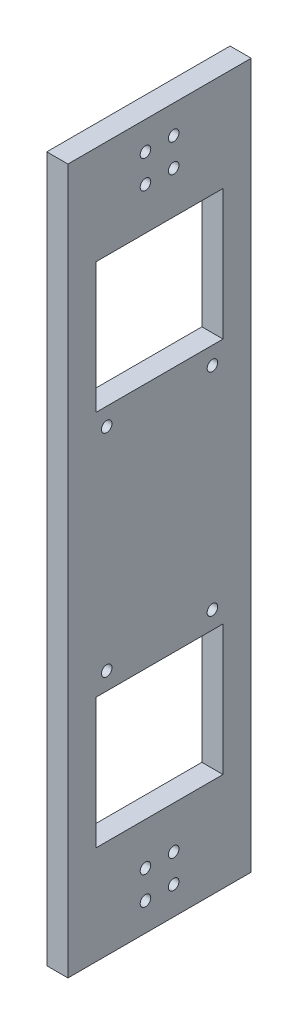
ISO-10303-21;
HEADER;
FILE_DESCRIPTION(('STEP AP214'),'2;1');
FILE_NAME('part.step','',(''),(''),'','','');
FILE_SCHEMA(('AUTOMOTIVE_DESIGN { 1 0 10303 214 1 1 1 1 }'));
ENDSEC;
DATA;
#1=APPLICATION_CONTEXT('core data for automotive mechanical design processes');
#2=APPLICATION_PROTOCOL_DEFINITION('international standard','automotive_design',2000,#1);
#3=PRODUCT_CONTEXT('',#1,'mechanical');
#4=PRODUCT('Part','Part','',(#3));
#5=PRODUCT_RELATED_PRODUCT_CATEGORY('part','',(#4));
#6=PRODUCT_DEFINITION_FORMATION('','',#4);
#7=PRODUCT_DEFINITION_CONTEXT('part definition',#1,'design');
#8=PRODUCT_DEFINITION('design','',#6,#7);
#9=PRODUCT_DEFINITION_SHAPE('','',#8);
#10=(LENGTH_UNIT() NAMED_UNIT(*) SI_UNIT(.MILLI.,.METRE.));
#11=(NAMED_UNIT(*) PLANE_ANGLE_UNIT() SI_UNIT($,.RADIAN.));
#12=(NAMED_UNIT(*) SI_UNIT($,.STERADIAN.) SOLID_ANGLE_UNIT());
#13=UNCERTAINTY_MEASURE_WITH_UNIT(LENGTH_MEASURE(1.E-05),#10,'distance_accuracy_value','');
#14=(GEOMETRIC_REPRESENTATION_CONTEXT(3) GLOBAL_UNCERTAINTY_ASSIGNED_CONTEXT((#13)) GLOBAL_UNIT_ASSIGNED_CONTEXT((#10,
#11,#12)) REPRESENTATION_CONTEXT('',''));
#15=CARTESIAN_POINT('',(0.,0.,0.));
#16=DIRECTION('',(0.,0.,1.));
#17=DIRECTION('',(1.,0.,0.));
#18=AXIS2_PLACEMENT_3D('',#15,#16,#17);
#19=CARTESIAN_POINT('',(-126.7,0.,0.));
#20=DIRECTION('',(-1.,0.,0.));
#21=DIRECTION('',(0.,0.,1.));
#22=AXIS2_PLACEMENT_3D('',#19,#20,#21);
#23=PLANE('',#22);
#24=DIRECTION('',(0.,-1.,0.));
#25=VECTOR('',#24,1.);
#26=CARTESIAN_POINT('',(-126.7,35.,18.));
#27=LINE('',#26,#25);
#28=CARTESIAN_POINT('',(-126.7,72.,18.));
#29=VERTEX_POINT('',#28);
#30=CARTESIAN_POINT('',(-126.7,35.,18.));
#31=VERTEX_POINT('',#30);
#32=EDGE_CURVE('E162',#29,#31,#27,.T.);
#33=ORIENTED_EDGE('',*,*,#32,.F.);
#34=DIRECTION('',(0.,0.,1.));
#35=VECTOR('',#34,1.);
#36=CARTESIAN_POINT('',(-126.7,72.,18.));
#37=LINE('',#36,#35);
#38=CARTESIAN_POINT('',(-126.7,72.,-18.));
#39=VERTEX_POINT('',#38);
#40=EDGE_CURVE('E170',#39,#29,#37,.T.);
#41=ORIENTED_EDGE('',*,*,#40,.F.);
#42=DIRECTION('',(0.,1.,0.));
#43=VECTOR('',#42,1.);
#44=CARTESIAN_POINT('',(-126.7,35.,-18.));
#45=LINE('',#44,#43);
#46=CARTESIAN_POINT('',(-126.7,35.,-18.));
#47=VERTEX_POINT('',#46);
#48=EDGE_CURVE('E167',#47,#39,#45,.T.);
#49=ORIENTED_EDGE('',*,*,#48,.F.);
#50=DIRECTION('',(0.,0.,-1.));
#51=VECTOR('',#50,1.);
#52=CARTESIAN_POINT('',(-126.7,35.,18.));
#53=LINE('',#52,#51);
#54=EDGE_CURVE('E164',#31,#47,#53,.T.);
#55=ORIENTED_EDGE('',*,*,#54,.F.);
#56=EDGE_LOOP('',(#33,#41,#49,#55));
#57=FACE_BOUND('',#56,.T.);
#58=CARTESIAN_POINT('',(-126.7,30.,-15.));
#59=DIRECTION('',(1.,0.,0.));
#60=DIRECTION('',(0.,0.,-1.));
#61=AXIS2_PLACEMENT_3D('',#58,#59,#60);
#62=CIRCLE('',#61,1.5);
#63=CARTESIAN_POINT('',(-126.7,30.,-16.5));
#64=VERTEX_POINT('',#63);
#65=EDGE_CURVE('E193',#64,#64,#62,.T.);
#66=ORIENTED_EDGE('',*,*,#65,.F.);
#67=EDGE_LOOP('',(#66));
#68=FACE_BOUND('',#67,.T.);
#69=CARTESIAN_POINT('',(-126.7,30.,15.));
#70=DIRECTION('',(1.,0.,0.));
#71=DIRECTION('',(0.,0.,-1.));
#72=AXIS2_PLACEMENT_3D('',#69,#70,#71);
#73=CIRCLE('',#72,1.5);
#74=CARTESIAN_POINT('',(-126.7,30.,13.5));
#75=VERTEX_POINT('',#74);
#76=EDGE_CURVE('E199',#75,#75,#73,.T.);
#77=ORIENTED_EDGE('',*,*,#76,.F.);
#78=EDGE_LOOP('',(#77));
#79=FACE_BOUND('',#78,.T.);
#80=CARTESIAN_POINT('',(-126.7,-30.,-15.));
#81=DIRECTION('',(1.,0.,0.));
#82=DIRECTION('',(0.,0.,-1.));
#83=AXIS2_PLACEMENT_3D('',#80,#81,#82);
#84=CIRCLE('',#83,1.5);
#85=CARTESIAN_POINT('',(-126.7,-30.,-16.5));
#86=VERTEX_POINT('',#85);
#87=EDGE_CURVE('E205',#86,#86,#84,.T.);
#88=ORIENTED_EDGE('',*,*,#87,.F.);
#89=EDGE_LOOP('',(#88));
#90=FACE_BOUND('',#89,.T.);
#91=CARTESIAN_POINT('',(-126.7,-30.,15.));
#92=DIRECTION('',(1.,0.,0.));
#93=DIRECTION('',(0.,0.,-1.));
#94=AXIS2_PLACEMENT_3D('',#91,#92,#93);
#95=CIRCLE('',#94,1.5);
#96=CARTESIAN_POINT('',(-126.7,-30.,13.5));
#97=VERTEX_POINT('',#96);
#98=EDGE_CURVE('E211',#97,#97,#95,.T.);
#99=ORIENTED_EDGE('',*,*,#98,.F.);
#100=EDGE_LOOP('',(#99));
#101=FACE_BOUND('',#100,.T.);
#102=CARTESIAN_POINT('',(-126.7,-84.,-4.));
#103=DIRECTION('',(1.,0.,0.));
#104=DIRECTION('',(0.,0.,-1.));
#105=AXIS2_PLACEMENT_3D('',#102,#103,#104);
#106=CIRCLE('',#105,1.5);
#107=CARTESIAN_POINT('',(-126.7,-84.,-5.5));
#108=VERTEX_POINT('',#107);
#109=EDGE_CURVE('E217',#108,#108,#106,.T.);
#110=ORIENTED_EDGE('',*,*,#109,.F.);
#111=EDGE_LOOP('',(#110));
#112=FACE_BOUND('',#111,.T.);
#113=CARTESIAN_POINT('',(-126.7,-84.,4.));
#114=DIRECTION('',(1.,0.,0.));
#115=DIRECTION('',(0.,0.,-1.));
#116=AXIS2_PLACEMENT_3D('',#113,#114,#115);
#117=CIRCLE('',#116,1.5);
#118=CARTESIAN_POINT('',(-126.7,-84.,2.5));
#119=VERTEX_POINT('',#118);
#120=EDGE_CURVE('E223',#119,#119,#117,.T.);
#121=ORIENTED_EDGE('',*,*,#120,.F.);
#122=EDGE_LOOP('',(#121));
#123=FACE_BOUND('',#122,.T.);
#124=CARTESIAN_POINT('',(-126.7,-92.,-4.));
#125=DIRECTION('',(1.,0.,0.));
#126=DIRECTION('',(0.,0.,-1.));
#127=AXIS2_PLACEMENT_3D('',#124,#125,#126);
#128=CIRCLE('',#127,1.5);
#129=CARTESIAN_POINT('',(-126.7,-92.,-5.5));
#130=VERTEX_POINT('',#129);
#131=EDGE_CURVE('E229',#130,#130,#128,.T.);
#132=ORIENTED_EDGE('',*,*,#131,.F.);
#133=EDGE_LOOP('',(#132));
#134=FACE_BOUND('',#133,.T.);
#135=CARTESIAN_POINT('',(-126.7,-92.,4.));
#136=DIRECTION('',(1.,0.,0.));
#137=DIRECTION('',(0.,0.,-1.));
#138=AXIS2_PLACEMENT_3D('',#135,#136,#137);
#139=CIRCLE('',#138,1.5);
#140=CARTESIAN_POINT('',(-126.7,-92.,2.5));
#141=VERTEX_POINT('',#140);
#142=EDGE_CURVE('E235',#141,#141,#139,.T.);
#143=ORIENTED_EDGE('',*,*,#142,.F.);
#144=EDGE_LOOP('',(#143));
#145=FACE_BOUND('',#144,.T.);
#146=CARTESIAN_POINT('',(-126.7,92.,-4.));
#147=DIRECTION('',(1.,0.,0.));
#148=DIRECTION('',(0.,0.,-1.));
#149=AXIS2_PLACEMENT_3D('',#146,#147,#148);
#150=CIRCLE('',#149,1.5);
#151=CARTESIAN_POINT('',(-126.7,92.,-5.5));
#152=VERTEX_POINT('',#151);
#153=EDGE_CURVE('E241',#152,#152,#150,.T.);
#154=ORIENTED_EDGE('',*,*,#153,.F.);
#155=EDGE_LOOP('',(#154));
#156=FACE_BOUND('',#155,.T.);
#157=CARTESIAN_POINT('',(-126.7,92.,4.));
#158=DIRECTION('',(1.,0.,0.));
#159=DIRECTION('',(0.,0.,-1.));
#160=AXIS2_PLACEMENT_3D('',#157,#158,#159);
#161=CIRCLE('',#160,1.5);
#162=CARTESIAN_POINT('',(-126.7,92.,2.5));
#163=VERTEX_POINT('',#162);
#164=EDGE_CURVE('E247',#163,#163,#161,.T.);
#165=ORIENTED_EDGE('',*,*,#164,.F.);
#166=EDGE_LOOP('',(#165));
#167=FACE_BOUND('',#166,.T.);
#168=CARTESIAN_POINT('',(-126.7,84.,-4.));
#169=DIRECTION('',(1.,0.,0.));
#170=DIRECTION('',(0.,0.,-1.));
#171=AXIS2_PLACEMENT_3D('',#168,#169,#170);
#172=CIRCLE('',#171,1.5);
#173=CARTESIAN_POINT('',(-126.7,84.,-5.5));
#174=VERTEX_POINT('',#173);
#175=EDGE_CURVE('E253',#174,#174,#172,.T.);
#176=ORIENTED_EDGE('',*,*,#175,.F.);
#177=EDGE_LOOP('',(#176));
#178=FACE_BOUND('',#177,.T.);
#179=CARTESIAN_POINT('',(-126.7,84.,4.));
#180=DIRECTION('',(1.,0.,0.));
#181=DIRECTION('',(0.,0.,-1.));
#182=AXIS2_PLACEMENT_3D('',#179,#180,#181);
#183=CIRCLE('',#182,1.5);
#184=CARTESIAN_POINT('',(-126.7,84.,2.5));
#185=VERTEX_POINT('',#184);
#186=EDGE_CURVE('E259',#185,#185,#183,.T.);
#187=ORIENTED_EDGE('',*,*,#186,.F.);
#188=EDGE_LOOP('',(#187));
#189=FACE_BOUND('',#188,.T.);
#190=DIRECTION('',(0.,-1.,0.));
#191=VECTOR('',#190,1.);
#192=CARTESIAN_POINT('',(-126.7,-100.,26.));
#193=LINE('',#192,#191);
#194=CARTESIAN_POINT('',(-126.7,100.,26.));
#195=VERTEX_POINT('',#194);
#196=CARTESIAN_POINT('',(-126.7,-100.,26.));
#197=VERTEX_POINT('',#196);
#198=EDGE_CURVE('E265',#195,#197,#193,.T.);
#199=ORIENTED_EDGE('',*,*,#198,.T.);
#200=DIRECTION('',(0.,0.,-1.));
#201=VECTOR('',#200,1.);
#202=CARTESIAN_POINT('',(-126.7,-100.,26.));
#203=LINE('',#202,#201);
#204=CARTESIAN_POINT('',(-126.7,-100.,-26.));
#205=VERTEX_POINT('',#204);
#206=EDGE_CURVE('E268',#197,#205,#203,.T.);
#207=ORIENTED_EDGE('',*,*,#206,.T.);
#208=DIRECTION('',(0.,1.,0.));
#209=VECTOR('',#208,1.);
#210=CARTESIAN_POINT('',(-126.7,-100.,-26.));
#211=LINE('',#210,#209);
#212=CARTESIAN_POINT('',(-126.7,100.,-26.));
#213=VERTEX_POINT('',#212);
#214=EDGE_CURVE('E271',#205,#213,#211,.T.);
#215=ORIENTED_EDGE('',*,*,#214,.T.);
#216=DIRECTION('',(0.,0.,1.));
#217=VECTOR('',#216,1.);
#218=CARTESIAN_POINT('',(-126.7,100.,26.));
#219=LINE('',#218,#217);
#220=EDGE_CURVE('E273',#213,#195,#219,.T.);
#221=ORIENTED_EDGE('',*,*,#220,.T.);
#222=EDGE_LOOP('',(#199,#207,#215,#221));
#223=FACE_BOUND('',#222,.T.);
#224=DIRECTION('',(0.,-1.,0.));
#225=VECTOR('',#224,1.);
#226=CARTESIAN_POINT('',(-126.7,-72.,18.));
#227=LINE('',#226,#225);
#228=CARTESIAN_POINT('',(-126.7,-35.,18.));
#229=VERTEX_POINT('',#228);
#230=CARTESIAN_POINT('',(-126.7,-72.,18.));
#231=VERTEX_POINT('',#230);
#232=EDGE_CURVE('E126',#229,#231,#227,.T.);
#233=ORIENTED_EDGE('',*,*,#232,.F.);
#234=DIRECTION('',(0.,0.,1.));
#235=VECTOR('',#234,1.);
#236=CARTESIAN_POINT('',(-126.7,-35.,18.));
#237=LINE('',#236,#235);
#238=CARTESIAN_POINT('',(-126.7,-35.,-18.));
#239=VERTEX_POINT('',#238);
#240=EDGE_CURVE('E148',#239,#229,#237,.T.);
#241=ORIENTED_EDGE('',*,*,#240,.F.);
#242=DIRECTION('',(0.,1.,0.));
#243=VECTOR('',#242,1.);
#244=CARTESIAN_POINT('',(-126.7,-72.,-18.));
#245=LINE('',#244,#243);
#246=CARTESIAN_POINT('',(-126.7,-72.,-18.));
#247=VERTEX_POINT('',#246);
#248=EDGE_CURVE('E146',#247,#239,#245,.T.);
#249=ORIENTED_EDGE('',*,*,#248,.F.);
#250=DIRECTION('',(0.,0.,-1.));
#251=VECTOR('',#250,1.);
#252=CARTESIAN_POINT('',(-126.7,-72.,18.));
#253=LINE('',#252,#251);
#254=EDGE_CURVE('E134',#231,#247,#253,.T.);
#255=ORIENTED_EDGE('',*,*,#254,.F.);
#256=EDGE_LOOP('',(#233,#241,#249,#255));
#257=FACE_BOUND('',#256,.T.);
#258=ADVANCED_FACE('F37',(#57,#68,#79,#90,#101,#112,#123,#134,#145,#156,#167,#178,#189,#223,
#257),#23,.F.);
#259=CARTESIAN_POINT('',(-132.7,0.,0.));
#260=DIRECTION('',(-1.,0.,0.));
#261=DIRECTION('',(0.,0.,1.));
#262=AXIS2_PLACEMENT_3D('',#259,#260,#261);
#263=PLANE('',#262);
#264=CARTESIAN_POINT('',(-132.7,30.,-15.));
#265=DIRECTION('',(1.,0.,0.));
#266=DIRECTION('',(0.,0.,-1.));
#267=AXIS2_PLACEMENT_3D('',#264,#265,#266);
#268=CIRCLE('',#267,1.5);
#269=CARTESIAN_POINT('',(-132.7,30.,-16.5));
#270=VERTEX_POINT('',#269);
#271=EDGE_CURVE('E192',#270,#270,#268,.T.);
#272=ORIENTED_EDGE('',*,*,#271,.T.);
#273=EDGE_LOOP('',(#272));
#274=FACE_BOUND('',#273,.T.);
#275=CARTESIAN_POINT('',(-132.7,30.,15.));
#276=DIRECTION('',(1.,0.,0.));
#277=DIRECTION('',(0.,0.,-1.));
#278=AXIS2_PLACEMENT_3D('',#275,#276,#277);
#279=CIRCLE('',#278,1.5);
#280=CARTESIAN_POINT('',(-132.7,30.,13.5));
#281=VERTEX_POINT('',#280);
#282=EDGE_CURVE('E196',#281,#281,#279,.T.);
#283=ORIENTED_EDGE('',*,*,#282,.T.);
#284=EDGE_LOOP('',(#283));
#285=FACE_BOUND('',#284,.T.);
#286=CARTESIAN_POINT('',(-132.7,-30.,-15.));
#287=DIRECTION('',(1.,0.,0.));
#288=DIRECTION('',(0.,0.,-1.));
#289=AXIS2_PLACEMENT_3D('',#286,#287,#288);
#290=CIRCLE('',#289,1.5);
#291=CARTESIAN_POINT('',(-132.7,-30.,-16.5));
#292=VERTEX_POINT('',#291);
#293=EDGE_CURVE('E202',#292,#292,#290,.T.);
#294=ORIENTED_EDGE('',*,*,#293,.T.);
#295=EDGE_LOOP('',(#294));
#296=FACE_BOUND('',#295,.T.);
#297=CARTESIAN_POINT('',(-132.7,-30.,15.));
#298=DIRECTION('',(1.,0.,0.));
#299=DIRECTION('',(0.,0.,-1.));
#300=AXIS2_PLACEMENT_3D('',#297,#298,#299);
#301=CIRCLE('',#300,1.5);
#302=CARTESIAN_POINT('',(-132.7,-30.,13.5));
#303=VERTEX_POINT('',#302);
#304=EDGE_CURVE('E208',#303,#303,#301,.T.);
#305=ORIENTED_EDGE('',*,*,#304,.T.);
#306=EDGE_LOOP('',(#305));
#307=FACE_BOUND('',#306,.T.);
#308=CARTESIAN_POINT('',(-132.7,-84.,-4.));
#309=DIRECTION('',(1.,0.,0.));
#310=DIRECTION('',(0.,0.,-1.));
#311=AXIS2_PLACEMENT_3D('',#308,#309,#310);
#312=CIRCLE('',#311,1.5);
#313=CARTESIAN_POINT('',(-132.7,-84.,-5.5));
#314=VERTEX_POINT('',#313);
#315=EDGE_CURVE('E214',#314,#314,#312,.T.);
#316=ORIENTED_EDGE('',*,*,#315,.T.);
#317=EDGE_LOOP('',(#316));
#318=FACE_BOUND('',#317,.T.);
#319=CARTESIAN_POINT('',(-132.7,-84.,4.));
#320=DIRECTION('',(1.,0.,0.));
#321=DIRECTION('',(0.,0.,-1.));
#322=AXIS2_PLACEMENT_3D('',#319,#320,#321);
#323=CIRCLE('',#322,1.5);
#324=CARTESIAN_POINT('',(-132.7,-84.,2.5));
#325=VERTEX_POINT('',#324);
#326=EDGE_CURVE('E220',#325,#325,#323,.T.);
#327=ORIENTED_EDGE('',*,*,#326,.T.);
#328=EDGE_LOOP('',(#327));
#329=FACE_BOUND('',#328,.T.);
#330=CARTESIAN_POINT('',(-132.7,-92.,-4.));
#331=DIRECTION('',(1.,0.,0.));
#332=DIRECTION('',(0.,0.,-1.));
#333=AXIS2_PLACEMENT_3D('',#330,#331,#332);
#334=CIRCLE('',#333,1.5);
#335=CARTESIAN_POINT('',(-132.7,-92.,-5.5));
#336=VERTEX_POINT('',#335);
#337=EDGE_CURVE('E226',#336,#336,#334,.T.);
#338=ORIENTED_EDGE('',*,*,#337,.T.);
#339=EDGE_LOOP('',(#338));
#340=FACE_BOUND('',#339,.T.);
#341=CARTESIAN_POINT('',(-132.7,-92.,4.));
#342=DIRECTION('',(1.,0.,0.));
#343=DIRECTION('',(0.,0.,-1.));
#344=AXIS2_PLACEMENT_3D('',#341,#342,#343);
#345=CIRCLE('',#344,1.5);
#346=CARTESIAN_POINT('',(-132.7,-92.,2.5));
#347=VERTEX_POINT('',#346);
#348=EDGE_CURVE('E232',#347,#347,#345,.T.);
#349=ORIENTED_EDGE('',*,*,#348,.T.);
#350=EDGE_LOOP('',(#349));
#351=FACE_BOUND('',#350,.T.);
#352=CARTESIAN_POINT('',(-132.7,92.,-4.));
#353=DIRECTION('',(1.,0.,0.));
#354=DIRECTION('',(0.,0.,-1.));
#355=AXIS2_PLACEMENT_3D('',#352,#353,#354);
#356=CIRCLE('',#355,1.5);
#357=CARTESIAN_POINT('',(-132.7,92.,-5.5));
#358=VERTEX_POINT('',#357);
#359=EDGE_CURVE('E238',#358,#358,#356,.T.);
#360=ORIENTED_EDGE('',*,*,#359,.T.);
#361=EDGE_LOOP('',(#360));
#362=FACE_BOUND('',#361,.T.);
#363=CARTESIAN_POINT('',(-132.7,92.,4.));
#364=DIRECTION('',(1.,0.,0.));
#365=DIRECTION('',(0.,0.,-1.));
#366=AXIS2_PLACEMENT_3D('',#363,#364,#365);
#367=CIRCLE('',#366,1.5);
#368=CARTESIAN_POINT('',(-132.7,92.,2.5));
#369=VERTEX_POINT('',#368);
#370=EDGE_CURVE('E244',#369,#369,#367,.T.);
#371=ORIENTED_EDGE('',*,*,#370,.T.);
#372=EDGE_LOOP('',(#371));
#373=FACE_BOUND('',#372,.T.);
#374=CARTESIAN_POINT('',(-132.7,84.,-4.));
#375=DIRECTION('',(1.,0.,0.));
#376=DIRECTION('',(0.,0.,-1.));
#377=AXIS2_PLACEMENT_3D('',#374,#375,#376);
#378=CIRCLE('',#377,1.5);
#379=CARTESIAN_POINT('',(-132.7,84.,-5.5));
#380=VERTEX_POINT('',#379);
#381=EDGE_CURVE('E250',#380,#380,#378,.T.);
#382=ORIENTED_EDGE('',*,*,#381,.T.);
#383=EDGE_LOOP('',(#382));
#384=FACE_BOUND('',#383,.T.);
#385=CARTESIAN_POINT('',(-132.7,84.,4.));
#386=DIRECTION('',(1.,0.,0.));
#387=DIRECTION('',(0.,0.,-1.));
#388=AXIS2_PLACEMENT_3D('',#385,#386,#387);
#389=CIRCLE('',#388,1.5);
#390=CARTESIAN_POINT('',(-132.7,84.,2.5));
#391=VERTEX_POINT('',#390);
#392=EDGE_CURVE('E256',#391,#391,#389,.T.);
#393=ORIENTED_EDGE('',*,*,#392,.T.);
#394=EDGE_LOOP('',(#393));
#395=FACE_BOUND('',#394,.T.);
#396=DIRECTION('',(0.,-1.,0.));
#397=VECTOR('',#396,1.);
#398=CARTESIAN_POINT('',(-132.7,-100.,26.));
#399=LINE('',#398,#397);
#400=CARTESIAN_POINT('',(-132.7,100.,26.));
#401=VERTEX_POINT('',#400);
#402=CARTESIAN_POINT('',(-132.7,-100.,26.));
#403=VERTEX_POINT('',#402);
#404=EDGE_CURVE('E262',#401,#403,#399,.T.);
#405=ORIENTED_EDGE('',*,*,#404,.F.);
#406=DIRECTION('',(0.,0.,1.));
#407=VECTOR('',#406,1.);
#408=CARTESIAN_POINT('',(-132.7,100.,26.));
#409=LINE('',#408,#407);
#410=CARTESIAN_POINT('',(-132.7,100.,-26.));
#411=VERTEX_POINT('',#410);
#412=EDGE_CURVE('E269',#411,#401,#409,.T.);
#413=ORIENTED_EDGE('',*,*,#412,.F.);
#414=DIRECTION('',(0.,1.,0.));
#415=VECTOR('',#414,1.);
#416=CARTESIAN_POINT('',(-132.7,-100.,-26.));
#417=LINE('',#416,#415);
#418=CARTESIAN_POINT('',(-132.7,-100.,-26.));
#419=VERTEX_POINT('',#418);
#420=EDGE_CURVE('E280',#419,#411,#417,.T.);
#421=ORIENTED_EDGE('',*,*,#420,.F.);
#422=DIRECTION('',(0.,0.,-1.));
#423=VECTOR('',#422,1.);
#424=CARTESIAN_POINT('',(-132.7,-100.,26.));
#425=LINE('',#424,#423);
#426=EDGE_CURVE('E278',#403,#419,#425,.T.);
#427=ORIENTED_EDGE('',*,*,#426,.F.);
#428=EDGE_LOOP('',(#405,#413,#421,#427));
#429=FACE_BOUND('',#428,.T.);
#430=DIRECTION('',(0.,0.,1.));
#431=VECTOR('',#430,1.);
#432=CARTESIAN_POINT('',(-132.7,72.,18.));
#433=LINE('',#432,#431);
#434=CARTESIAN_POINT('',(-132.7,72.,-18.));
#435=VERTEX_POINT('',#434);
#436=CARTESIAN_POINT('',(-132.7,72.,18.));
#437=VERTEX_POINT('',#436);
#438=EDGE_CURVE('E165',#435,#437,#433,.T.);
#439=ORIENTED_EDGE('',*,*,#438,.T.);
#440=DIRECTION('',(0.,-1.,0.));
#441=VECTOR('',#440,1.);
#442=CARTESIAN_POINT('',(-132.7,35.,18.));
#443=LINE('',#442,#441);
#444=CARTESIAN_POINT('',(-132.7,35.,18.));
#445=VERTEX_POINT('',#444);
#446=EDGE_CURVE('E142',#437,#445,#443,.T.);
#447=ORIENTED_EDGE('',*,*,#446,.T.);
#448=DIRECTION('',(0.,0.,-1.));
#449=VECTOR('',#448,1.);
#450=CARTESIAN_POINT('',(-132.7,35.,18.));
#451=LINE('',#450,#449);
#452=CARTESIAN_POINT('',(-132.7,35.,-18.));
#453=VERTEX_POINT('',#452);
#454=EDGE_CURVE('E175',#445,#453,#451,.T.);
#455=ORIENTED_EDGE('',*,*,#454,.T.);
#456=DIRECTION('',(0.,1.,0.));
#457=VECTOR('',#456,1.);
#458=CARTESIAN_POINT('',(-132.7,35.,-18.));
#459=LINE('',#458,#457);
#460=EDGE_CURVE('E178',#453,#435,#459,.T.);
#461=ORIENTED_EDGE('',*,*,#460,.T.);
#462=EDGE_LOOP('',(#439,#447,#455,#461));
#463=FACE_BOUND('',#462,.T.);
#464=DIRECTION('',(0.,0.,1.));
#465=VECTOR('',#464,1.);
#466=CARTESIAN_POINT('',(-132.7,-35.,18.));
#467=LINE('',#466,#465);
#468=CARTESIAN_POINT('',(-132.7,-35.,-18.));
#469=VERTEX_POINT('',#468);
#470=CARTESIAN_POINT('',(-132.7,-35.,18.));
#471=VERTEX_POINT('',#470);
#472=EDGE_CURVE('E135',#469,#471,#467,.T.);
#473=ORIENTED_EDGE('',*,*,#472,.T.);
#474=DIRECTION('',(0.,-1.,0.));
#475=VECTOR('',#474,1.);
#476=CARTESIAN_POINT('',(-132.7,-72.,18.));
#477=LINE('',#476,#475);
#478=CARTESIAN_POINT('',(-132.7,-72.,18.));
#479=VERTEX_POINT('',#478);
#480=EDGE_CURVE('E60',#471,#479,#477,.T.);
#481=ORIENTED_EDGE('',*,*,#480,.T.);
#482=DIRECTION('',(0.,0.,-1.));
#483=VECTOR('',#482,1.);
#484=CARTESIAN_POINT('',(-132.7,-72.,18.));
#485=LINE('',#484,#483);
#486=CARTESIAN_POINT('',(-132.7,-72.,-18.));
#487=VERTEX_POINT('',#486);
#488=EDGE_CURVE('E141',#479,#487,#485,.T.);
#489=ORIENTED_EDGE('',*,*,#488,.T.);
#490=DIRECTION('',(0.,1.,0.));
#491=VECTOR('',#490,1.);
#492=CARTESIAN_POINT('',(-132.7,-72.,-18.));
#493=LINE('',#492,#491);
#494=EDGE_CURVE('E154',#487,#469,#493,.T.);
#495=ORIENTED_EDGE('',*,*,#494,.T.);
#496=EDGE_LOOP('',(#473,#481,#489,#495));
#497=FACE_BOUND('',#496,.T.);
#498=ADVANCED_FACE('F298',(#274,#285,#296,#307,#318,#329,#340,#351,#362,#373,#384,#395,#429,
#463,#497),#263,.T.);
#499=CARTESIAN_POINT('',(-126.7,-100.,26.));
#500=DIRECTION('',(0.,0.,-1.));
#501=DIRECTION('',(-1.,0.,0.));
#502=AXIS2_PLACEMENT_3D('',#499,#500,#501);
#503=PLANE('',#502);
#504=ORIENTED_EDGE('',*,*,#404,.T.);
#505=DIRECTION('',(-1.,0.,0.));
#506=VECTOR('',#505,1.);
#507=CARTESIAN_POINT('',(-126.7,-100.,26.));
#508=LINE('',#507,#506);
#509=EDGE_CURVE('E11',#197,#403,#508,.T.);
#510=ORIENTED_EDGE('',*,*,#509,.F.);
#511=ORIENTED_EDGE('',*,*,#198,.F.);
#512=DIRECTION('',(-1.,0.,0.));
#513=VECTOR('',#512,1.);
#514=CARTESIAN_POINT('',(-126.7,100.,26.));
#515=LINE('',#514,#513);
#516=EDGE_CURVE('E275',#195,#401,#515,.T.);
#517=ORIENTED_EDGE('',*,*,#516,.T.);
#518=EDGE_LOOP('',(#504,#510,#511,#517));
#519=FACE_BOUND('',#518,.T.);
#520=ADVANCED_FACE('F39',(#519),#503,.F.);
#521=CARTESIAN_POINT('',(-126.7,-100.,26.));
#522=DIRECTION('',(0.,1.,0.));
#523=DIRECTION('',(0.,0.,1.));
#524=AXIS2_PLACEMENT_3D('',#521,#522,#523);
#525=PLANE('',#524);
#526=ORIENTED_EDGE('',*,*,#426,.T.);
#527=DIRECTION('',(-1.,0.,0.));
#528=VECTOR('',#527,1.);
#529=CARTESIAN_POINT('',(-126.7,-100.,-26.));
#530=LINE('',#529,#528);
#531=EDGE_CURVE('E45',#205,#419,#530,.T.);
#532=ORIENTED_EDGE('',*,*,#531,.F.);
#533=ORIENTED_EDGE('',*,*,#206,.F.);
#534=ORIENTED_EDGE('',*,*,#509,.T.);
#535=EDGE_LOOP('',(#526,#532,#533,#534));
#536=FACE_BOUND('',#535,.T.);
#537=ADVANCED_FACE('F308',(#536),#525,.F.);
#538=CARTESIAN_POINT('',(-126.7,-100.,-26.));
#539=DIRECTION('',(0.,0.,1.));
#540=DIRECTION('',(1.,0.,0.));
#541=AXIS2_PLACEMENT_3D('',#538,#539,#540);
#542=PLANE('',#541);
#543=ORIENTED_EDGE('',*,*,#420,.T.);
#544=DIRECTION('',(-1.,0.,0.));
#545=VECTOR('',#544,1.);
#546=CARTESIAN_POINT('',(-126.7,100.,-26.));
#547=LINE('',#546,#545);
#548=EDGE_CURVE('E285',#213,#411,#547,.T.);
#549=ORIENTED_EDGE('',*,*,#548,.F.);
#550=ORIENTED_EDGE('',*,*,#214,.F.);
#551=ORIENTED_EDGE('',*,*,#531,.T.);
#552=EDGE_LOOP('',(#543,#549,#550,#551));
#553=FACE_BOUND('',#552,.T.);
#554=ADVANCED_FACE('F292',(#553),#542,.F.);
#555=CARTESIAN_POINT('',(-126.7,100.,26.));
#556=DIRECTION('',(0.,-1.,0.));
#557=DIRECTION('',(0.,0.,-1.));
#558=AXIS2_PLACEMENT_3D('',#555,#556,#557);
#559=PLANE('',#558);
#560=ORIENTED_EDGE('',*,*,#412,.T.);
#561=ORIENTED_EDGE('',*,*,#516,.F.);
#562=ORIENTED_EDGE('',*,*,#220,.F.);
#563=ORIENTED_EDGE('',*,*,#548,.T.);
#564=EDGE_LOOP('',(#560,#561,#562,#563));
#565=FACE_BOUND('',#564,.T.);
#566=ADVANCED_FACE('F302',(#565),#559,.F.);
#567=CARTESIAN_POINT('',(-126.7,84.,4.));
#568=DIRECTION('',(-1.,0.,0.));
#569=DIRECTION('',(0.,0.,1.));
#570=AXIS2_PLACEMENT_3D('',#567,#568,#569);
#571=CYLINDRICAL_SURFACE('',#570,1.5);
#572=ORIENTED_EDGE('',*,*,#186,.T.);
#573=EDGE_LOOP('',(#572));
#574=FACE_BOUND('',#573,.T.);
#575=ORIENTED_EDGE('',*,*,#392,.F.);
#576=EDGE_LOOP('',(#575));
#577=FACE_BOUND('',#576,.T.);
#578=ADVANCED_FACE('F326',(#574,#577),#571,.F.);
#579=CARTESIAN_POINT('',(-126.7,84.,-4.));
#580=DIRECTION('',(-1.,0.,0.));
#581=DIRECTION('',(0.,0.,1.));
#582=AXIS2_PLACEMENT_3D('',#579,#580,#581);
#583=CYLINDRICAL_SURFACE('',#582,1.5);
#584=ORIENTED_EDGE('',*,*,#175,.T.);
#585=EDGE_LOOP('',(#584));
#586=FACE_BOUND('',#585,.T.);
#587=ORIENTED_EDGE('',*,*,#381,.F.);
#588=EDGE_LOOP('',(#587));
#589=FACE_BOUND('',#588,.T.);
#590=ADVANCED_FACE('F333',(#586,#589),#583,.F.);
#591=CARTESIAN_POINT('',(-126.7,92.,4.));
#592=DIRECTION('',(-1.,0.,0.));
#593=DIRECTION('',(0.,0.,1.));
#594=AXIS2_PLACEMENT_3D('',#591,#592,#593);
#595=CYLINDRICAL_SURFACE('',#594,1.5);
#596=ORIENTED_EDGE('',*,*,#164,.T.);
#597=EDGE_LOOP('',(#596));
#598=FACE_BOUND('',#597,.T.);
#599=ORIENTED_EDGE('',*,*,#370,.F.);
#600=EDGE_LOOP('',(#599));
#601=FACE_BOUND('',#600,.T.);
#602=ADVANCED_FACE('F338',(#598,#601),#595,.F.);
#603=CARTESIAN_POINT('',(-126.7,92.,-4.));
#604=DIRECTION('',(-1.,0.,0.));
#605=DIRECTION('',(0.,0.,1.));
#606=AXIS2_PLACEMENT_3D('',#603,#604,#605);
#607=CYLINDRICAL_SURFACE('',#606,1.5);
#608=ORIENTED_EDGE('',*,*,#153,.T.);
#609=EDGE_LOOP('',(#608));
#610=FACE_BOUND('',#609,.T.);
#611=ORIENTED_EDGE('',*,*,#359,.F.);
#612=EDGE_LOOP('',(#611));
#613=FACE_BOUND('',#612,.T.);
#614=ADVANCED_FACE('F348',(#610,#613),#607,.F.);
#615=CARTESIAN_POINT('',(-126.7,-92.,4.));
#616=DIRECTION('',(-1.,0.,0.));
#617=DIRECTION('',(0.,0.,1.));
#618=AXIS2_PLACEMENT_3D('',#615,#616,#617);
#619=CYLINDRICAL_SURFACE('',#618,1.5);
#620=ORIENTED_EDGE('',*,*,#142,.T.);
#621=EDGE_LOOP('',(#620));
#622=FACE_BOUND('',#621,.T.);
#623=ORIENTED_EDGE('',*,*,#348,.F.);
#624=EDGE_LOOP('',(#623));
#625=FACE_BOUND('',#624,.T.);
#626=ADVANCED_FACE('F355',(#622,#625),#619,.F.);
#627=CARTESIAN_POINT('',(-126.7,-92.,-4.));
#628=DIRECTION('',(-1.,0.,0.));
#629=DIRECTION('',(0.,0.,1.));
#630=AXIS2_PLACEMENT_3D('',#627,#628,#629);
#631=CYLINDRICAL_SURFACE('',#630,1.5);
#632=ORIENTED_EDGE('',*,*,#131,.T.);
#633=EDGE_LOOP('',(#632));
#634=FACE_BOUND('',#633,.T.);
#635=ORIENTED_EDGE('',*,*,#337,.F.);
#636=EDGE_LOOP('',(#635));
#637=FACE_BOUND('',#636,.T.);
#638=ADVANCED_FACE('F359',(#634,#637),#631,.F.);
#639=CARTESIAN_POINT('',(-126.7,-84.,4.));
#640=DIRECTION('',(-1.,0.,0.));
#641=DIRECTION('',(0.,0.,1.));
#642=AXIS2_PLACEMENT_3D('',#639,#640,#641);
#643=CYLINDRICAL_SURFACE('',#642,1.5);
#644=ORIENTED_EDGE('',*,*,#120,.T.);
#645=EDGE_LOOP('',(#644));
#646=FACE_BOUND('',#645,.T.);
#647=ORIENTED_EDGE('',*,*,#326,.F.);
#648=EDGE_LOOP('',(#647));
#649=FACE_BOUND('',#648,.T.);
#650=ADVANCED_FACE('F363',(#646,#649),#643,.F.);
#651=CARTESIAN_POINT('',(-126.7,-84.,-4.));
#652=DIRECTION('',(-1.,0.,0.));
#653=DIRECTION('',(0.,0.,1.));
#654=AXIS2_PLACEMENT_3D('',#651,#652,#653);
#655=CYLINDRICAL_SURFACE('',#654,1.5);
#656=ORIENTED_EDGE('',*,*,#109,.T.);
#657=EDGE_LOOP('',(#656));
#658=FACE_BOUND('',#657,.T.);
#659=ORIENTED_EDGE('',*,*,#315,.F.);
#660=EDGE_LOOP('',(#659));
#661=FACE_BOUND('',#660,.T.);
#662=ADVANCED_FACE('F367',(#658,#661),#655,.F.);
#663=CARTESIAN_POINT('',(-126.7,-30.,15.));
#664=DIRECTION('',(-1.,0.,0.));
#665=DIRECTION('',(0.,0.,1.));
#666=AXIS2_PLACEMENT_3D('',#663,#664,#665);
#667=CYLINDRICAL_SURFACE('',#666,1.5);
#668=ORIENTED_EDGE('',*,*,#98,.T.);
#669=EDGE_LOOP('',(#668));
#670=FACE_BOUND('',#669,.T.);
#671=ORIENTED_EDGE('',*,*,#304,.F.);
#672=EDGE_LOOP('',(#671));
#673=FACE_BOUND('',#672,.T.);
#674=ADVANCED_FACE('F371',(#670,#673),#667,.F.);
#675=CARTESIAN_POINT('',(-126.7,-30.,-15.));
#676=DIRECTION('',(-1.,0.,0.));
#677=DIRECTION('',(0.,0.,1.));
#678=AXIS2_PLACEMENT_3D('',#675,#676,#677);
#679=CYLINDRICAL_SURFACE('',#678,1.5);
#680=ORIENTED_EDGE('',*,*,#87,.T.);
#681=EDGE_LOOP('',(#680));
#682=FACE_BOUND('',#681,.T.);
#683=ORIENTED_EDGE('',*,*,#293,.F.);
#684=EDGE_LOOP('',(#683));
#685=FACE_BOUND('',#684,.T.);
#686=ADVANCED_FACE('F375',(#682,#685),#679,.F.);
#687=CARTESIAN_POINT('',(-126.7,30.,15.));
#688=DIRECTION('',(-1.,0.,0.));
#689=DIRECTION('',(0.,0.,1.));
#690=AXIS2_PLACEMENT_3D('',#687,#688,#689);
#691=CYLINDRICAL_SURFACE('',#690,1.5);
#692=ORIENTED_EDGE('',*,*,#76,.T.);
#693=EDGE_LOOP('',(#692));
#694=FACE_BOUND('',#693,.T.);
#695=ORIENTED_EDGE('',*,*,#282,.F.);
#696=EDGE_LOOP('',(#695));
#697=FACE_BOUND('',#696,.T.);
#698=ADVANCED_FACE('F379',(#694,#697),#691,.F.);
#699=CARTESIAN_POINT('',(-126.7,30.,-15.));
#700=DIRECTION('',(-1.,0.,0.));
#701=DIRECTION('',(0.,0.,1.));
#702=AXIS2_PLACEMENT_3D('',#699,#700,#701);
#703=CYLINDRICAL_SURFACE('',#702,1.5);
#704=ORIENTED_EDGE('',*,*,#65,.T.);
#705=EDGE_LOOP('',(#704));
#706=FACE_BOUND('',#705,.T.);
#707=ORIENTED_EDGE('',*,*,#271,.F.);
#708=EDGE_LOOP('',(#707));
#709=FACE_BOUND('',#708,.T.);
#710=ADVANCED_FACE('F383',(#706,#709),#703,.F.);
#711=CARTESIAN_POINT('',(-126.7,35.,18.));
#712=DIRECTION('',(0.,0.,-1.));
#713=DIRECTION('',(-1.,0.,0.));
#714=AXIS2_PLACEMENT_3D('',#711,#712,#713);
#715=PLANE('',#714);
#716=ORIENTED_EDGE('',*,*,#446,.F.);
#717=DIRECTION('',(-1.,0.,0.));
#718=VECTOR('',#717,1.);
#719=CARTESIAN_POINT('',(-126.7,72.,18.));
#720=LINE('',#719,#718);
#721=EDGE_CURVE('E172',#29,#437,#720,.T.);
#722=ORIENTED_EDGE('',*,*,#721,.F.);
#723=ORIENTED_EDGE('',*,*,#32,.T.);
#724=DIRECTION('',(-1.,0.,0.));
#725=VECTOR('',#724,1.);
#726=CARTESIAN_POINT('',(-126.7,35.,18.));
#727=LINE('',#726,#725);
#728=EDGE_CURVE('E189',#31,#445,#727,.T.);
#729=ORIENTED_EDGE('',*,*,#728,.T.);
#730=EDGE_LOOP('',(#716,#722,#723,#729));
#731=FACE_BOUND('',#730,.T.);
#732=ADVANCED_FACE('F387',(#731),#715,.T.);
#733=CARTESIAN_POINT('',(-126.7,35.,18.));
#734=DIRECTION('',(0.,1.,0.));
#735=DIRECTION('',(0.,0.,1.));
#736=AXIS2_PLACEMENT_3D('',#733,#734,#735);
#737=PLANE('',#736);
#738=ORIENTED_EDGE('',*,*,#454,.F.);
#739=ORIENTED_EDGE('',*,*,#728,.F.);
#740=ORIENTED_EDGE('',*,*,#54,.T.);
#741=DIRECTION('',(-1.,0.,0.));
#742=VECTOR('',#741,1.);
#743=CARTESIAN_POINT('',(-126.7,35.,-18.));
#744=LINE('',#743,#742);
#745=EDGE_CURVE('E187',#47,#453,#744,.T.);
#746=ORIENTED_EDGE('',*,*,#745,.T.);
#747=EDGE_LOOP('',(#738,#739,#740,#746));
#748=FACE_BOUND('',#747,.T.);
#749=ADVANCED_FACE('F391',(#748),#737,.T.);
#750=CARTESIAN_POINT('',(-126.7,35.,-18.));
#751=DIRECTION('',(0.,0.,1.));
#752=DIRECTION('',(1.,0.,0.));
#753=AXIS2_PLACEMENT_3D('',#750,#751,#752);
#754=PLANE('',#753);
#755=ORIENTED_EDGE('',*,*,#460,.F.);
#756=ORIENTED_EDGE('',*,*,#745,.F.);
#757=ORIENTED_EDGE('',*,*,#48,.T.);
#758=DIRECTION('',(-1.,0.,0.));
#759=VECTOR('',#758,1.);
#760=CARTESIAN_POINT('',(-126.7,72.,-18.));
#761=LINE('',#760,#759);
#762=EDGE_CURVE('E185',#39,#435,#761,.T.);
#763=ORIENTED_EDGE('',*,*,#762,.T.);
#764=EDGE_LOOP('',(#755,#756,#757,#763));
#765=FACE_BOUND('',#764,.T.);
#766=ADVANCED_FACE('F395',(#765),#754,.T.);
#767=CARTESIAN_POINT('',(-126.7,72.,18.));
#768=DIRECTION('',(0.,-1.,0.));
#769=DIRECTION('',(0.,0.,-1.));
#770=AXIS2_PLACEMENT_3D('',#767,#768,#769);
#771=PLANE('',#770);
#772=ORIENTED_EDGE('',*,*,#438,.F.);
#773=ORIENTED_EDGE('',*,*,#762,.F.);
#774=ORIENTED_EDGE('',*,*,#40,.T.);
#775=ORIENTED_EDGE('',*,*,#721,.T.);
#776=EDGE_LOOP('',(#772,#773,#774,#775));
#777=FACE_BOUND('',#776,.T.);
#778=ADVANCED_FACE('F399',(#777),#771,.T.);
#779=CARTESIAN_POINT('',(-126.7,-72.,18.));
#780=DIRECTION('',(0.,0.,-1.));
#781=DIRECTION('',(-1.,0.,0.));
#782=AXIS2_PLACEMENT_3D('',#779,#780,#781);
#783=PLANE('',#782);
#784=ORIENTED_EDGE('',*,*,#480,.F.);
#785=DIRECTION('',(-1.,0.,0.));
#786=VECTOR('',#785,1.);
#787=CARTESIAN_POINT('',(-126.7,-35.,18.));
#788=LINE('',#787,#786);
#789=EDGE_CURVE('E130',#229,#471,#788,.T.);
#790=ORIENTED_EDGE('',*,*,#789,.F.);
#791=ORIENTED_EDGE('',*,*,#232,.T.);
#792=DIRECTION('',(-1.,0.,0.));
#793=VECTOR('',#792,1.);
#794=CARTESIAN_POINT('',(-126.7,-72.,18.));
#795=LINE('',#794,#793);
#796=EDGE_CURVE('E129',#231,#479,#795,.T.);
#797=ORIENTED_EDGE('',*,*,#796,.T.);
#798=EDGE_LOOP('',(#784,#790,#791,#797));
#799=FACE_BOUND('',#798,.T.);
#800=ADVANCED_FACE('F128',(#799),#783,.T.);
#801=CARTESIAN_POINT('',(-126.7,-72.,18.));
#802=DIRECTION('',(0.,1.,0.));
#803=DIRECTION('',(0.,0.,1.));
#804=AXIS2_PLACEMENT_3D('',#801,#802,#803);
#805=PLANE('',#804);
#806=ORIENTED_EDGE('',*,*,#488,.F.);
#807=ORIENTED_EDGE('',*,*,#796,.F.);
#808=ORIENTED_EDGE('',*,*,#254,.T.);
#809=DIRECTION('',(-1.,0.,0.));
#810=VECTOR('',#809,1.);
#811=CARTESIAN_POINT('',(-126.7,-72.,-18.));
#812=LINE('',#811,#810);
#813=EDGE_CURVE('E143',#247,#487,#812,.T.);
#814=ORIENTED_EDGE('',*,*,#813,.T.);
#815=EDGE_LOOP('',(#806,#807,#808,#814));
#816=FACE_BOUND('',#815,.T.);
#817=ADVANCED_FACE('F138',(#816),#805,.T.);
#818=CARTESIAN_POINT('',(-126.7,-72.,-18.));
#819=DIRECTION('',(0.,0.,1.));
#820=DIRECTION('',(1.,0.,0.));
#821=AXIS2_PLACEMENT_3D('',#818,#819,#820);
#822=PLANE('',#821);
#823=ORIENTED_EDGE('',*,*,#494,.F.);
#824=ORIENTED_EDGE('',*,*,#813,.F.);
#825=ORIENTED_EDGE('',*,*,#248,.T.);
#826=DIRECTION('',(-1.,0.,0.));
#827=VECTOR('',#826,1.);
#828=CARTESIAN_POINT('',(-126.7,-35.,-18.));
#829=LINE('',#828,#827);
#830=EDGE_CURVE('E52',#239,#469,#829,.T.);
#831=ORIENTED_EDGE('',*,*,#830,.T.);
#832=EDGE_LOOP('',(#823,#824,#825,#831));
#833=FACE_BOUND('',#832,.T.);
#834=ADVANCED_FACE('F408',(#833),#822,.T.);
#835=CARTESIAN_POINT('',(-126.7,-35.,18.));
#836=DIRECTION('',(0.,-1.,0.));
#837=DIRECTION('',(0.,0.,-1.));
#838=AXIS2_PLACEMENT_3D('',#835,#836,#837);
#839=PLANE('',#838);
#840=ORIENTED_EDGE('',*,*,#472,.F.);
#841=ORIENTED_EDGE('',*,*,#830,.F.);
#842=ORIENTED_EDGE('',*,*,#240,.T.);
#843=ORIENTED_EDGE('',*,*,#789,.T.);
#844=EDGE_LOOP('',(#840,#841,#842,#843));
#845=FACE_BOUND('',#844,.T.);
#846=ADVANCED_FACE('F411',(#845),#839,.T.);
#847=CLOSED_SHELL('',(#258,#498,#520,#537,#554,#566,#578,#590,#602,#614,#626,#638,#650,#662,
#674,#686,#698,#710,#732,#749,#766,#778,#800,#817,#834,#846));
#848=MANIFOLD_SOLID_BREP('B2',#847);
#849=ADVANCED_BREP_SHAPE_REPRESENTATION('',(#18,#848),#14);
#850=SHAPE_DEFINITION_REPRESENTATION(#9,#849);
ENDSEC;
END-ISO-10303-21;
